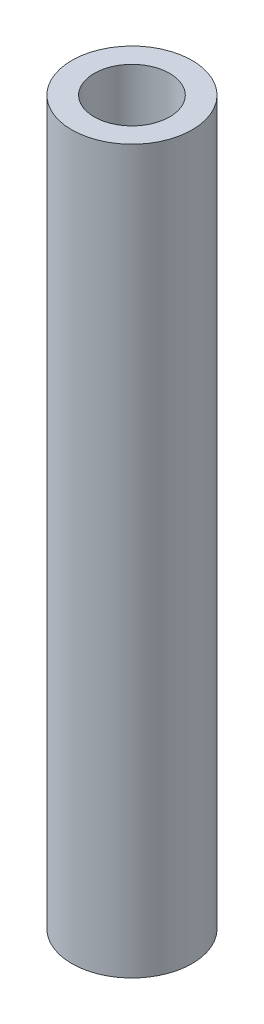
ISO-10303-21;
HEADER;
FILE_DESCRIPTION(('STEP AP214'),'2;1');
FILE_NAME('part.step','',(''),(''),'','','');
FILE_SCHEMA(('AUTOMOTIVE_DESIGN { 1 0 10303 214 1 1 1 1 }'));
ENDSEC;
DATA;
#1=APPLICATION_CONTEXT('core data for automotive mechanical design processes');
#2=APPLICATION_PROTOCOL_DEFINITION('international standard','automotive_design',2000,#1);
#3=PRODUCT_CONTEXT('',#1,'mechanical');
#4=PRODUCT('Part','Part','',(#3));
#5=PRODUCT_RELATED_PRODUCT_CATEGORY('part','',(#4));
#6=PRODUCT_DEFINITION_FORMATION('','',#4);
#7=PRODUCT_DEFINITION_CONTEXT('part definition',#1,'design');
#8=PRODUCT_DEFINITION('design','',#6,#7);
#9=PRODUCT_DEFINITION_SHAPE('','',#8);
#10=(LENGTH_UNIT() NAMED_UNIT(*) SI_UNIT(.MILLI.,.METRE.));
#11=(NAMED_UNIT(*) PLANE_ANGLE_UNIT() SI_UNIT($,.RADIAN.));
#12=(NAMED_UNIT(*) SI_UNIT($,.STERADIAN.) SOLID_ANGLE_UNIT());
#13=UNCERTAINTY_MEASURE_WITH_UNIT(LENGTH_MEASURE(1.E-05),#10,'distance_accuracy_value','');
#14=(GEOMETRIC_REPRESENTATION_CONTEXT(3) GLOBAL_UNCERTAINTY_ASSIGNED_CONTEXT((#13)) GLOBAL_UNIT_ASSIGNED_CONTEXT((#10,
#11,#12)) REPRESENTATION_CONTEXT('',''));
#15=CARTESIAN_POINT('',(0.,0.,0.));
#16=DIRECTION('',(0.,0.,1.));
#17=DIRECTION('',(1.,0.,0.));
#18=AXIS2_PLACEMENT_3D('',#15,#16,#17);
#19=CARTESIAN_POINT('',(0.,47.625,0.));
#20=DIRECTION('',(0.,-1.,0.));
#21=DIRECTION('',(0.,0.,-1.));
#22=AXIS2_PLACEMENT_3D('',#19,#20,#21);
#23=CYLINDRICAL_SURFACE('',#22,3.96875);
#24=CARTESIAN_POINT('',(0.,47.625,0.));
#25=DIRECTION('',(0.,1.,0.));
#26=DIRECTION('',(0.,0.,1.));
#27=AXIS2_PLACEMENT_3D('',#24,#25,#26);
#28=CIRCLE('',#27,3.96875);
#29=CARTESIAN_POINT('',(0.,47.625,3.96875));
#30=VERTEX_POINT('',#29);
#31=EDGE_CURVE('E10',#30,#30,#28,.T.);
#32=ORIENTED_EDGE('',*,*,#31,.F.);
#33=EDGE_LOOP('',(#32));
#34=FACE_BOUND('',#33,.T.);
#35=CARTESIAN_POINT('',(0.,0.,0.));
#36=DIRECTION('',(0.,1.,0.));
#37=DIRECTION('',(0.,0.,1.));
#38=AXIS2_PLACEMENT_3D('',#35,#36,#37);
#39=CIRCLE('',#38,3.96875);
#40=CARTESIAN_POINT('',(0.,0.,3.96875));
#41=VERTEX_POINT('',#40);
#42=EDGE_CURVE('E46',#41,#41,#39,.T.);
#43=ORIENTED_EDGE('',*,*,#42,.T.);
#44=EDGE_LOOP('',(#43));
#45=FACE_BOUND('',#44,.T.);
#46=ADVANCED_FACE('F43',(#34,#45),#23,.T.);
#47=CARTESIAN_POINT('',(0.,47.625,0.));
#48=DIRECTION('',(0.,1.,0.));
#49=DIRECTION('',(0.,0.,1.));
#50=AXIS2_PLACEMENT_3D('',#47,#48,#49);
#51=PLANE('',#50);
#52=CARTESIAN_POINT('',(0.,47.625,0.));
#53=DIRECTION('',(0.,1.,0.));
#54=DIRECTION('',(0.,0.,1.));
#55=AXIS2_PLACEMENT_3D('',#52,#53,#54);
#56=CIRCLE('',#55,2.48919999999999);
#57=CARTESIAN_POINT('',(0.,47.625,2.48919999999999));
#58=VERTEX_POINT('',#57);
#59=EDGE_CURVE('E60',#58,#58,#56,.T.);
#60=ORIENTED_EDGE('',*,*,#59,.F.);
#61=EDGE_LOOP('',(#60));
#62=FACE_BOUND('',#61,.T.);
#63=ORIENTED_EDGE('',*,*,#31,.T.);
#64=EDGE_LOOP('',(#63));
#65=FACE_BOUND('',#64,.T.);
#66=ADVANCED_FACE('F67',(#62,#65),#51,.T.);
#67=CARTESIAN_POINT('',(0.,0.,0.));
#68=DIRECTION('',(0.,1.,0.));
#69=DIRECTION('',(0.,0.,1.));
#70=AXIS2_PLACEMENT_3D('',#67,#68,#69);
#71=PLANE('',#70);
#72=CARTESIAN_POINT('',(0.,0.,0.));
#73=DIRECTION('',(0.,1.,0.));
#74=DIRECTION('',(0.,0.,1.));
#75=AXIS2_PLACEMENT_3D('',#72,#73,#74);
#76=CIRCLE('',#75,2.48919999999999);
#77=CARTESIAN_POINT('',(0.,0.,2.48919999999999));
#78=VERTEX_POINT('',#77);
#79=EDGE_CURVE('E55',#78,#78,#76,.T.);
#80=ORIENTED_EDGE('',*,*,#79,.T.);
#81=EDGE_LOOP('',(#80));
#82=FACE_BOUND('',#81,.T.);
#83=ORIENTED_EDGE('',*,*,#42,.F.);
#84=EDGE_LOOP('',(#83));
#85=FACE_BOUND('',#84,.T.);
#86=ADVANCED_FACE('F69',(#82,#85),#71,.F.);
#87=CARTESIAN_POINT('',(0.,47.625,0.));
#88=DIRECTION('',(0.,1.,0.));
#89=DIRECTION('',(0.,0.,1.));
#90=AXIS2_PLACEMENT_3D('',#87,#88,#89);
#91=CYLINDRICAL_SURFACE('',#90,2.48919999999999);
#92=ORIENTED_EDGE('',*,*,#79,.F.);
#93=EDGE_LOOP('',(#92));
#94=FACE_BOUND('',#93,.T.);
#95=ORIENTED_EDGE('',*,*,#59,.T.);
#96=EDGE_LOOP('',(#95));
#97=FACE_BOUND('',#96,.T.);
#98=ADVANCED_FACE('F65',(#94,#97),#91,.F.);
#99=CLOSED_SHELL('',(#46,#66,#86,#98));
#100=MANIFOLD_SOLID_BREP('B2',#99);
#101=ADVANCED_BREP_SHAPE_REPRESENTATION('',(#18,#100),#14);
#102=SHAPE_DEFINITION_REPRESENTATION(#9,#101);
ENDSEC;
END-ISO-10303-21;
